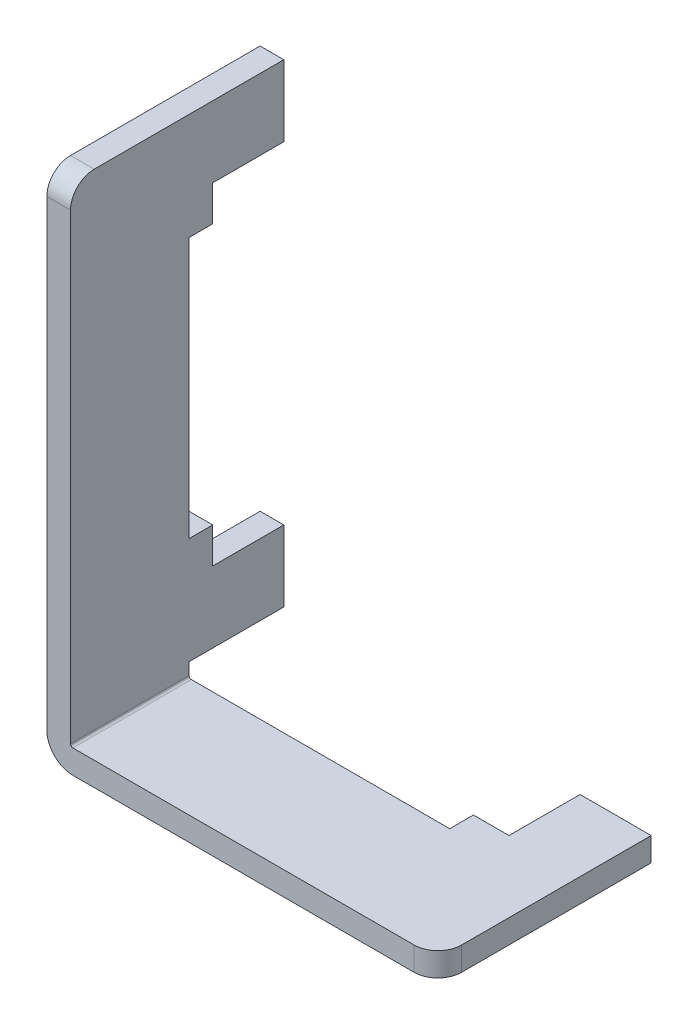
ISO-10303-21;
HEADER;
FILE_DESCRIPTION(('STEP AP214'),'2;1');
FILE_NAME('part.step','',(''),(''),'','','');
FILE_SCHEMA(('AUTOMOTIVE_DESIGN { 1 0 10303 214 1 1 1 1 }'));
ENDSEC;
DATA;
#1=APPLICATION_CONTEXT('core data for automotive mechanical design processes');
#2=APPLICATION_PROTOCOL_DEFINITION('international standard','automotive_design',2000,#1);
#3=PRODUCT_CONTEXT('',#1,'mechanical');
#4=PRODUCT('Part','Part','',(#3));
#5=PRODUCT_RELATED_PRODUCT_CATEGORY('part','',(#4));
#6=PRODUCT_DEFINITION_FORMATION('','',#4);
#7=PRODUCT_DEFINITION_CONTEXT('part definition',#1,'design');
#8=PRODUCT_DEFINITION('design','',#6,#7);
#9=PRODUCT_DEFINITION_SHAPE('','',#8);
#10=(LENGTH_UNIT() NAMED_UNIT(*) SI_UNIT(.MILLI.,.METRE.));
#11=(NAMED_UNIT(*) PLANE_ANGLE_UNIT() SI_UNIT($,.RADIAN.));
#12=(NAMED_UNIT(*) SI_UNIT($,.STERADIAN.) SOLID_ANGLE_UNIT());
#13=UNCERTAINTY_MEASURE_WITH_UNIT(LENGTH_MEASURE(1.E-05),#10,'distance_accuracy_value','');
#14=(GEOMETRIC_REPRESENTATION_CONTEXT(3) GLOBAL_UNCERTAINTY_ASSIGNED_CONTEXT((#13)) GLOBAL_UNIT_ASSIGNED_CONTEXT((#10,
#11,#12)) REPRESENTATION_CONTEXT('',''));
#15=CARTESIAN_POINT('',(0.,0.,0.));
#16=DIRECTION('',(0.,0.,1.));
#17=DIRECTION('',(1.,0.,0.));
#18=AXIS2_PLACEMENT_3D('',#15,#16,#17);
#19=CARTESIAN_POINT('',(-247.66652677768,182.23713577262,9.500000000004));
#20=DIRECTION('',(-1.,0.,0.));
#21=DIRECTION('',(0.,0.,1.));
#22=AXIS2_PLACEMENT_3D('',#19,#20,#21);
#23=PLANE('',#22);
#24=DIRECTION('',(0.,0.,1.));
#25=VECTOR('',#24,1.);
#26=CARTESIAN_POINT('',(-247.66652677768,218.87457845392,1.));
#27=LINE('',#26,#25);
#28=CARTESIAN_POINT('',(-247.66652677768,218.87457845392,1.));
#29=VERTEX_POINT('',#28);
#30=CARTESIAN_POINT('',(-247.66652677768,218.87457845392,6.000000000004));
#31=VERTEX_POINT('',#30);
#32=EDGE_CURVE('E11',#29,#31,#27,.T.);
#33=ORIENTED_EDGE('',*,*,#32,.F.);
#34=DIRECTION('',(0.,1.,0.));
#35=VECTOR('',#34,1.);
#36=CARTESIAN_POINT('',(-247.66652677768,218.87457845392,1.));
#37=LINE('',#36,#35);
#38=CARTESIAN_POINT('',(-247.66652677768,219.37457949272,1.));
#39=VERTEX_POINT('',#38);
#40=EDGE_CURVE('E408',#29,#39,#37,.T.);
#41=ORIENTED_EDGE('',*,*,#40,.T.);
#42=DIRECTION('',(0.,0.,1.));
#43=VECTOR('',#42,1.);
#44=CARTESIAN_POINT('',(-247.66652677768,219.37457949272,-3.));
#45=LINE('',#44,#43);
#46=CARTESIAN_POINT('',(-247.66652677768,219.37457949272,-3.));
#47=VERTEX_POINT('',#46);
#48=EDGE_CURVE('E400',#47,#39,#45,.T.);
#49=ORIENTED_EDGE('',*,*,#48,.F.);
#50=DIRECTION('',(0.,-1.,0.));
#51=VECTOR('',#50,1.);
#52=CARTESIAN_POINT('',(-247.66652677768,222.37457949272,-3.));
#53=LINE('',#52,#51);
#54=CARTESIAN_POINT('',(-247.66652677768,222.37457949272,-3.));
#55=VERTEX_POINT('',#54);
#56=EDGE_CURVE('E393',#55,#47,#53,.T.);
#57=ORIENTED_EDGE('',*,*,#56,.F.);
#58=DIRECTION('',(0.,0.,1.));
#59=VECTOR('',#58,1.);
#60=CARTESIAN_POINT('',(-247.66652677768,222.37457949272,-3.));
#61=LINE('',#60,#59);
#62=CARTESIAN_POINT('',(-247.66652677768,222.37457949272,0.));
#63=VERTEX_POINT('',#62);
#64=EDGE_CURVE('E386',#55,#63,#61,.T.);
#65=ORIENTED_EDGE('',*,*,#64,.T.);
#66=DIRECTION('',(0.,1.,0.));
#67=VECTOR('',#66,1.);
#68=CARTESIAN_POINT('',(-247.66652677768,222.37457949272,0.));
#69=LINE('',#68,#67);
#70=CARTESIAN_POINT('',(-247.66652677768,223.87457949272,0.));
#71=VERTEX_POINT('',#70);
#72=EDGE_CURVE('E379',#63,#71,#69,.T.);
#73=ORIENTED_EDGE('',*,*,#72,.T.);
#74=DIRECTION('',(0.,0.,1.));
#75=VECTOR('',#74,1.);
#76=CARTESIAN_POINT('',(-247.66652677768,223.87457949272,0.));
#77=LINE('',#76,#75);
#78=CARTESIAN_POINT('',(-247.66652677768,223.87457949272,1.));
#79=VERTEX_POINT('',#78);
#80=EDGE_CURVE('E236',#71,#79,#77,.T.);
#81=ORIENTED_EDGE('',*,*,#80,.T.);
#82=DIRECTION('',(0.,1.,0.));
#83=VECTOR('',#82,1.);
#84=CARTESIAN_POINT('',(-247.66652677768,223.87457949272,1.));
#85=LINE('',#84,#83);
#86=CARTESIAN_POINT('',(-247.66652677768,234.87457863472,1.));
#87=VERTEX_POINT('',#86);
#88=EDGE_CURVE('E237',#79,#87,#85,.T.);
#89=ORIENTED_EDGE('',*,*,#88,.T.);
#90=DIRECTION('',(0.,0.,-1.));
#91=VECTOR('',#90,1.);
#92=CARTESIAN_POINT('',(-247.66652677768,234.87457863472,1.));
#93=LINE('',#92,#91);
#94=CARTESIAN_POINT('',(-247.66652677768,234.87457863472,0.));
#95=VERTEX_POINT('',#94);
#96=EDGE_CURVE('E368',#87,#95,#93,.T.);
#97=ORIENTED_EDGE('',*,*,#96,.T.);
#98=DIRECTION('',(0.,-1.,0.));
#99=VECTOR('',#98,1.);
#100=CARTESIAN_POINT('',(-247.66652677768,236.37457800002,0.));
#101=LINE('',#100,#99);
#102=CARTESIAN_POINT('',(-247.66652677768,236.37457800002,0.));
#103=VERTEX_POINT('',#102);
#104=EDGE_CURVE('E360',#103,#95,#101,.T.);
#105=ORIENTED_EDGE('',*,*,#104,.F.);
#106=DIRECTION('',(0.,0.,-1.));
#107=VECTOR('',#106,1.);
#108=CARTESIAN_POINT('',(-247.66652677768,236.37457800002,0.));
#109=LINE('',#108,#107);
#110=CARTESIAN_POINT('',(-247.66652677768,236.37457800002,-3.));
#111=VERTEX_POINT('',#110);
#112=EDGE_CURVE('E223',#103,#111,#109,.T.);
#113=ORIENTED_EDGE('',*,*,#112,.T.);
#114=DIRECTION('',(0.,1.,0.));
#115=VECTOR('',#114,1.);
#116=CARTESIAN_POINT('',(-247.66652677768,236.37457800002,-3.));
#117=LINE('',#116,#115);
#118=CARTESIAN_POINT('',(-247.66652677768,239.37457800002,-3.));
#119=VERTEX_POINT('',#118);
#120=EDGE_CURVE('E352',#111,#119,#117,.T.);
#121=ORIENTED_EDGE('',*,*,#120,.T.);
#122=DIRECTION('',(0.,0.,1.));
#123=VECTOR('',#122,1.);
#124=CARTESIAN_POINT('',(-247.66652677768,239.37457800002,-3.));
#125=LINE('',#124,#123);
#126=CARTESIAN_POINT('',(-247.66652677768,239.37457800002,5.000000000004));
#127=VERTEX_POINT('',#126);
#128=EDGE_CURVE('E282',#119,#127,#125,.T.);
#129=ORIENTED_EDGE('',*,*,#128,.T.);
#130=CARTESIAN_POINT('',(-247.66652677768,238.37457800002,5.000000000004));
#131=DIRECTION('',(1.,0.,0.));
#132=DIRECTION('',(0.,1.,0.));
#133=AXIS2_PLACEMENT_3D('',#130,#131,#132);
#134=CIRCLE('',#133,1.);
#135=CARTESIAN_POINT('',(-247.66652677768,238.37457800002,6.000000000004));
#136=VERTEX_POINT('',#135);
#137=EDGE_CURVE('E289',#127,#136,#134,.T.);
#138=ORIENTED_EDGE('',*,*,#137,.T.);
#139=DIRECTION('',(0.,-1.,0.));
#140=VECTOR('',#139,1.);
#141=CARTESIAN_POINT('',(-247.66652677768,238.37457800002,6.000000000004));
#142=LINE('',#141,#140);
#143=EDGE_CURVE('E267',#136,#31,#142,.T.);
#144=ORIENTED_EDGE('',*,*,#143,.T.);
#145=EDGE_LOOP('',(#33,#41,#49,#57,#65,#73,#81,#89,#97,#105,#113,#121,#129,#138,#144));
#146=FACE_BOUND('',#145,.T.);
#147=ADVANCED_FACE('F16',(#146),#23,.F.);
#148=CARTESIAN_POINT('',(-247.56652677768,218.87457845392,9.500000000004));
#149=DIRECTION('',(0.,0.,1.));
#150=DIRECTION('',(1.,0.,0.));
#151=AXIS2_PLACEMENT_3D('',#148,#149,#150);
#152=CYLINDRICAL_SURFACE('',#151,0.1);
#153=CARTESIAN_POINT('',(-247.56652677768,218.87457845392,1.));
#154=DIRECTION('',(0.,0.,1.));
#155=DIRECTION('',(-1.,5.684341886081E-13,0.));
#156=AXIS2_PLACEMENT_3D('',#153,#154,#155);
#157=CIRCLE('',#156,0.1);
#158=CARTESIAN_POINT('',(-247.56652677768,218.77457845392,1.));
#159=VERTEX_POINT('',#158);
#160=EDGE_CURVE('E411',#29,#159,#157,.T.);
#161=ORIENTED_EDGE('',*,*,#160,.F.);
#162=ORIENTED_EDGE('',*,*,#32,.T.);
#163=CARTESIAN_POINT('',(-247.56652677768,218.87457845392,6.000000000004));
#164=DIRECTION('',(0.,0.,-1.));
#165=DIRECTION('',(0.,-1.,0.));
#166=AXIS2_PLACEMENT_3D('',#163,#164,#165);
#167=CIRCLE('',#166,0.1);
#168=CARTESIAN_POINT('',(-247.56652677768,218.77457845392,6.000000000004));
#169=VERTEX_POINT('',#168);
#170=EDGE_CURVE('E241',#169,#31,#167,.T.);
#171=ORIENTED_EDGE('',*,*,#170,.F.);
#172=DIRECTION('',(0.,0.,-1.));
#173=VECTOR('',#172,1.);
#174=CARTESIAN_POINT('',(-247.56652677768,218.77457845392,6.000000000004));
#175=LINE('',#174,#173);
#176=EDGE_CURVE('E19',#169,#159,#175,.T.);
#177=ORIENTED_EDGE('',*,*,#176,.T.);
#178=EDGE_LOOP('',(#161,#162,#171,#177));
#179=FACE_BOUND('',#178,.T.);
#180=ADVANCED_FACE('F444',(#179),#152,.F.);
#181=CARTESIAN_POINT('',(-253.64712145909,218.77457845392,9.500000000004));
#182=DIRECTION('',(0.,-1.,0.));
#183=DIRECTION('',(0.,0.,-1.));
#184=AXIS2_PLACEMENT_3D('',#181,#182,#183);
#185=PLANE('',#184);
#186=DIRECTION('',(-1.,0.,0.));
#187=VECTOR('',#186,1.);
#188=CARTESIAN_POINT('',(-232.1665294591,218.77457845392,-3.));
#189=LINE('',#188,#187);
#190=CARTESIAN_POINT('',(-232.1665294591,218.77457845392,-3.));
#191=VERTEX_POINT('',#190);
#192=CARTESIAN_POINT('',(-235.1665294591,218.77457845392,-3.));
#193=VERTEX_POINT('',#192);
#194=EDGE_CURVE('E424',#191,#193,#189,.T.);
#195=ORIENTED_EDGE('',*,*,#194,.T.);
#196=DIRECTION('',(0.,0.,1.));
#197=VECTOR('',#196,1.);
#198=CARTESIAN_POINT('',(-235.1665294591,218.77457845392,-3.));
#199=LINE('',#198,#197);
#200=CARTESIAN_POINT('',(-235.1665294591,218.77457845392,0.));
#201=VERTEX_POINT('',#200);
#202=EDGE_CURVE('E219',#193,#201,#199,.T.);
#203=ORIENTED_EDGE('',*,*,#202,.T.);
#204=DIRECTION('',(-1.,0.,0.));
#205=VECTOR('',#204,1.);
#206=CARTESIAN_POINT('',(-235.1665294591,218.77457845392,0.));
#207=LINE('',#206,#205);
#208=CARTESIAN_POINT('',(-236.6665294591,218.77457845392,0.));
#209=VERTEX_POINT('',#208);
#210=EDGE_CURVE('E345',#201,#209,#207,.T.);
#211=ORIENTED_EDGE('',*,*,#210,.T.);
#212=DIRECTION('',(0.,0.,1.));
#213=VECTOR('',#212,1.);
#214=CARTESIAN_POINT('',(-236.6665294591,218.77457845392,0.));
#215=LINE('',#214,#213);
#216=CARTESIAN_POINT('',(-236.6665294591,218.77457845392,1.));
#217=VERTEX_POINT('',#216);
#218=EDGE_CURVE('E336',#209,#217,#215,.T.);
#219=ORIENTED_EDGE('',*,*,#218,.T.);
#220=DIRECTION('',(-1.,0.,0.));
#221=VECTOR('',#220,1.);
#222=CARTESIAN_POINT('',(-236.6665294591,218.77457845392,1.));
#223=LINE('',#222,#221);
#224=EDGE_CURVE('E218',#217,#159,#223,.T.);
#225=ORIENTED_EDGE('',*,*,#224,.T.);
#226=ORIENTED_EDGE('',*,*,#176,.F.);
#227=DIRECTION('',(1.,0.,0.));
#228=VECTOR('',#227,1.);
#229=CARTESIAN_POINT('',(-247.56652677768,218.77457845392,6.000000000004));
#230=LINE('',#229,#228);
#231=CARTESIAN_POINT('',(-233.1665294591,218.77457845392,6.000000000004));
#232=VERTEX_POINT('',#231);
#233=EDGE_CURVE('E238',#169,#232,#230,.T.);
#234=ORIENTED_EDGE('',*,*,#233,.T.);
#235=CARTESIAN_POINT('',(-233.1665294591,218.77457845392,5.000000000004));
#236=DIRECTION('',(0.,1.,0.));
#237=DIRECTION('',(0.,0.,1.));
#238=AXIS2_PLACEMENT_3D('',#235,#236,#237);
#239=CIRCLE('',#238,1.);
#240=CARTESIAN_POINT('',(-232.1665294591,218.77457845392,5.000000000004));
#241=VERTEX_POINT('',#240);
#242=EDGE_CURVE('E32',#232,#241,#239,.T.);
#243=ORIENTED_EDGE('',*,*,#242,.T.);
#244=DIRECTION('',(0.,0.,-1.));
#245=VECTOR('',#244,1.);
#246=CARTESIAN_POINT('',(-232.1665294591,218.77457845392,5.000000000004));
#247=LINE('',#246,#245);
#248=EDGE_CURVE('E37',#241,#191,#247,.T.);
#249=ORIENTED_EDGE('',*,*,#248,.T.);
#250=EDGE_LOOP('',(#195,#203,#211,#219,#225,#226,#234,#243,#249));
#251=FACE_BOUND('',#250,.T.);
#252=ADVANCED_FACE('F448',(#251),#185,.F.);
#253=CARTESIAN_POINT('',(-233.1665294591,217.77457845392,5.000000000004));
#254=DIRECTION('',(0.,-1.,0.));
#255=DIRECTION('',(-1.,0.,0.));
#256=AXIS2_PLACEMENT_3D('',#253,#254,#255);
#257=CYLINDRICAL_SURFACE('',#256,1.);
#258=ORIENTED_EDGE('',*,*,#242,.F.);
#259=DIRECTION('',(0.,-1.,0.));
#260=VECTOR('',#259,1.);
#261=CARTESIAN_POINT('',(-233.1665294591,218.77457845392,6.000000000004));
#262=LINE('',#261,#260);
#263=CARTESIAN_POINT('',(-233.1665294591,217.77457845392,6.000000000004));
#264=VERTEX_POINT('',#263);
#265=EDGE_CURVE('E189',#232,#264,#262,.T.);
#266=ORIENTED_EDGE('',*,*,#265,.T.);
#267=CARTESIAN_POINT('',(-233.1665294591,217.77457845392,5.000000000004));
#268=DIRECTION('',(0.,-1.,0.));
#269=DIRECTION('',(1.,0.,1.06581410364E-12));
#270=AXIS2_PLACEMENT_3D('',#267,#268,#269);
#271=CIRCLE('',#270,1.);
#272=CARTESIAN_POINT('',(-232.1665294591,217.77457845392,5.000000000004));
#273=VERTEX_POINT('',#272);
#274=EDGE_CURVE('E259',#273,#264,#271,.T.);
#275=ORIENTED_EDGE('',*,*,#274,.F.);
#276=DIRECTION('',(0.,1.,0.));
#277=VECTOR('',#276,1.);
#278=CARTESIAN_POINT('',(-232.1665294591,217.77457845392,5.000000000004));
#279=LINE('',#278,#277);
#280=EDGE_CURVE('E432',#273,#241,#279,.T.);
#281=ORIENTED_EDGE('',*,*,#280,.T.);
#282=EDGE_LOOP('',(#258,#266,#275,#281));
#283=FACE_BOUND('',#282,.T.);
#284=ADVANCED_FACE('F459',(#283),#257,.T.);
#285=CARTESIAN_POINT('',(-232.1665294591,218.27457845392,1.500000000004));
#286=DIRECTION('',(1.,0.,0.));
#287=DIRECTION('',(0.,1.,0.));
#288=AXIS2_PLACEMENT_3D('',#285,#286,#287);
#289=PLANE('',#288);
#290=DIRECTION('',(0.,1.,0.));
#291=VECTOR('',#290,1.);
#292=CARTESIAN_POINT('',(-232.1665294591,217.77457845392,-3.));
#293=LINE('',#292,#291);
#294=CARTESIAN_POINT('',(-232.1665294591,217.77457845392,-3.));
#295=VERTEX_POINT('',#294);
#296=EDGE_CURVE('E427',#295,#191,#293,.T.);
#297=ORIENTED_EDGE('',*,*,#296,.T.);
#298=ORIENTED_EDGE('',*,*,#248,.F.);
#299=ORIENTED_EDGE('',*,*,#280,.F.);
#300=DIRECTION('',(0.,0.,-1.));
#301=VECTOR('',#300,1.);
#302=CARTESIAN_POINT('',(-232.1665294591,217.77457845392,5.000000000004));
#303=LINE('',#302,#301);
#304=EDGE_CURVE('E246',#273,#295,#303,.T.);
#305=ORIENTED_EDGE('',*,*,#304,.T.);
#306=EDGE_LOOP('',(#297,#298,#299,#305));
#307=FACE_BOUND('',#306,.T.);
#308=ADVANCED_FACE('F462',(#307),#289,.T.);
#309=CARTESIAN_POINT('',(-238.1665294591,217.77457845392,-3.));
#310=DIRECTION('',(0.,0.,-1.));
#311=DIRECTION('',(0.,-1.,0.));
#312=AXIS2_PLACEMENT_3D('',#309,#310,#311);
#313=PLANE('',#312);
#314=DIRECTION('',(0.,-1.,0.));
#315=VECTOR('',#314,1.);
#316=CARTESIAN_POINT('',(-235.1665294591,218.77457845392,-3.));
#317=LINE('',#316,#315);
#318=CARTESIAN_POINT('',(-235.1665294591,217.77457845392,-3.));
#319=VERTEX_POINT('',#318);
#320=EDGE_CURVE('E220',#193,#319,#317,.T.);
#321=ORIENTED_EDGE('',*,*,#320,.F.);
#322=ORIENTED_EDGE('',*,*,#194,.F.);
#323=ORIENTED_EDGE('',*,*,#296,.F.);
#324=DIRECTION('',(-1.,0.,0.));
#325=VECTOR('',#324,1.);
#326=CARTESIAN_POINT('',(-232.1665294591,217.77457845392,-3.));
#327=LINE('',#326,#325);
#328=EDGE_CURVE('E242',#295,#319,#327,.T.);
#329=ORIENTED_EDGE('',*,*,#328,.T.);
#330=EDGE_LOOP('',(#321,#322,#323,#329));
#331=FACE_BOUND('',#330,.T.);
#332=ADVANCED_FACE('F467',(#331),#313,.T.);
#333=CARTESIAN_POINT('',(-235.1665294591,217.77457845392,0.));
#334=DIRECTION('',(-1.,0.,0.));
#335=DIRECTION('',(0.,0.,1.));
#336=AXIS2_PLACEMENT_3D('',#333,#334,#335);
#337=PLANE('',#336);
#338=DIRECTION('',(0.,1.,0.));
#339=VECTOR('',#338,1.);
#340=CARTESIAN_POINT('',(-235.1665294591,217.77457845392,0.));
#341=LINE('',#340,#339);
#342=CARTESIAN_POINT('',(-235.1665294591,217.77457845392,0.));
#343=VERTEX_POINT('',#342);
#344=EDGE_CURVE('E221',#343,#201,#341,.T.);
#345=ORIENTED_EDGE('',*,*,#344,.T.);
#346=ORIENTED_EDGE('',*,*,#202,.F.);
#347=ORIENTED_EDGE('',*,*,#320,.T.);
#348=DIRECTION('',(0.,0.,1.));
#349=VECTOR('',#348,1.);
#350=CARTESIAN_POINT('',(-235.1665294591,217.77457845392,-3.));
#351=LINE('',#350,#349);
#352=EDGE_CURVE('E247',#319,#343,#351,.T.);
#353=ORIENTED_EDGE('',*,*,#352,.T.);
#354=EDGE_LOOP('',(#345,#346,#347,#353));
#355=FACE_BOUND('',#354,.T.);
#356=ADVANCED_FACE('F472',(#355),#337,.T.);
#357=CARTESIAN_POINT('',(-241.3665281184,218.27457845392,0.));
#358=DIRECTION('',(0.,0.,-1.));
#359=DIRECTION('',(0.,-1.,0.));
#360=AXIS2_PLACEMENT_3D('',#357,#358,#359);
#361=PLANE('',#360);
#362=ORIENTED_EDGE('',*,*,#210,.F.);
#363=ORIENTED_EDGE('',*,*,#344,.F.);
#364=DIRECTION('',(1.,0.,0.));
#365=VECTOR('',#364,1.);
#366=CARTESIAN_POINT('',(-236.6665294591,217.77457845392,0.));
#367=LINE('',#366,#365);
#368=CARTESIAN_POINT('',(-236.6665294591,217.77457845392,0.));
#369=VERTEX_POINT('',#368);
#370=EDGE_CURVE('E263',#369,#343,#367,.T.);
#371=ORIENTED_EDGE('',*,*,#370,.F.);
#372=DIRECTION('',(0.,-1.,0.));
#373=VECTOR('',#372,1.);
#374=CARTESIAN_POINT('',(-236.6665294591,218.77457845392,0.));
#375=LINE('',#374,#373);
#376=EDGE_CURVE('E339',#209,#369,#375,.T.);
#377=ORIENTED_EDGE('',*,*,#376,.F.);
#378=EDGE_LOOP('',(#362,#363,#371,#377));
#379=FACE_BOUND('',#378,.T.);
#380=ADVANCED_FACE('F476',(#379),#361,.T.);
#381=CARTESIAN_POINT('',(-236.6665294591,218.77457845392,1.));
#382=DIRECTION('',(-1.,0.,0.));
#383=DIRECTION('',(0.,0.,1.));
#384=AXIS2_PLACEMENT_3D('',#381,#382,#383);
#385=PLANE('',#384);
#386=ORIENTED_EDGE('',*,*,#218,.F.);
#387=ORIENTED_EDGE('',*,*,#376,.T.);
#388=DIRECTION('',(0.,0.,1.));
#389=VECTOR('',#388,1.);
#390=CARTESIAN_POINT('',(-236.6665294591,217.77457845392,0.));
#391=LINE('',#390,#389);
#392=CARTESIAN_POINT('',(-236.6665294591,217.77457845392,1.));
#393=VERTEX_POINT('',#392);
#394=EDGE_CURVE('E250',#369,#393,#391,.T.);
#395=ORIENTED_EDGE('',*,*,#394,.T.);
#396=DIRECTION('',(0.,-1.,0.));
#397=VECTOR('',#396,1.);
#398=CARTESIAN_POINT('',(-236.6665294591,218.77457845392,1.));
#399=LINE('',#398,#397);
#400=EDGE_CURVE('E340',#217,#393,#399,.T.);
#401=ORIENTED_EDGE('',*,*,#400,.F.);
#402=EDGE_LOOP('',(#386,#387,#395,#401));
#403=FACE_BOUND('',#402,.T.);
#404=ADVANCED_FACE('F479',(#403),#385,.T.);
#405=CARTESIAN_POINT('',(-246.64712145909,217.77457845392,1.));
#406=DIRECTION('',(0.,0.,-1.));
#407=DIRECTION('',(0.,-1.,0.));
#408=AXIS2_PLACEMENT_3D('',#405,#406,#407);
#409=PLANE('',#408);
#410=DIRECTION('',(-1.98436515405206E-06,0.999999999998031,0.));
#411=VECTOR('',#410,1.);
#412=CARTESIAN_POINT('',(-248.66652677768,218.87457845392,1.));
#413=LINE('',#412,#411);
#414=CARTESIAN_POINT('',(-248.66652677768,218.87457845392,1.));
#415=VERTEX_POINT('',#414);
#416=CARTESIAN_POINT('',(-248.66652776986,219.37457949272,1.));
#417=VERTEX_POINT('',#416);
#418=EDGE_CURVE('E198',#415,#417,#413,.T.);
#419=ORIENTED_EDGE('',*,*,#418,.T.);
#420=DIRECTION('',(1.,0.,0.));
#421=VECTOR('',#420,1.);
#422=CARTESIAN_POINT('',(-248.66652776986,219.37457949272,1.));
#423=LINE('',#422,#421);
#424=EDGE_CURVE('E404',#417,#39,#423,.T.);
#425=ORIENTED_EDGE('',*,*,#424,.T.);
#426=ORIENTED_EDGE('',*,*,#40,.F.);
#427=ORIENTED_EDGE('',*,*,#160,.T.);
#428=ORIENTED_EDGE('',*,*,#224,.F.);
#429=ORIENTED_EDGE('',*,*,#400,.T.);
#430=DIRECTION('',(-1.,0.,0.));
#431=VECTOR('',#430,1.);
#432=CARTESIAN_POINT('',(-236.6665294591,217.77457845392,1.));
#433=LINE('',#432,#431);
#434=CARTESIAN_POINT('',(-247.56652677768,217.77457845392,1.));
#435=VERTEX_POINT('',#434);
#436=EDGE_CURVE('E232',#393,#435,#433,.T.);
#437=ORIENTED_EDGE('',*,*,#436,.T.);
#438=CARTESIAN_POINT('',(-247.56652677768,218.87457845392,1.));
#439=DIRECTION('',(0.,0.,-1.));
#440=DIRECTION('',(0.,-1.,0.));
#441=AXIS2_PLACEMENT_3D('',#438,#439,#440);
#442=CIRCLE('',#441,1.1);
#443=EDGE_CURVE('E203',#435,#415,#442,.T.);
#444=ORIENTED_EDGE('',*,*,#443,.T.);
#445=EDGE_LOOP('',(#419,#425,#426,#427,#428,#429,#437,#444));
#446=FACE_BOUND('',#445,.T.);
#447=ADVANCED_FACE('F452',(#446),#409,.T.);
#448=CARTESIAN_POINT('',(-248.66652975423,219.37457949272,1.));
#449=DIRECTION('',(0.,-1.,0.));
#450=DIRECTION('',(0.,0.,-1.));
#451=AXIS2_PLACEMENT_3D('',#448,#449,#450);
#452=PLANE('',#451);
#453=DIRECTION('',(2.48046166717593E-07,0.,0.999999999999969));
#454=VECTOR('',#453,1.);
#455=CARTESIAN_POINT('',(-248.66652876205,219.37457949272,-3.));
#456=LINE('',#455,#454);
#457=CARTESIAN_POINT('',(-248.66652876205,219.37457949272,-3.));
#458=VERTEX_POINT('',#457);
#459=EDGE_CURVE('E335',#458,#417,#456,.T.);
#460=ORIENTED_EDGE('',*,*,#459,.F.);
#461=DIRECTION('',(-1.,0.,0.));
#462=VECTOR('',#461,1.);
#463=CARTESIAN_POINT('',(-247.66652677768,219.37457949272,-3.));
#464=LINE('',#463,#462);
#465=EDGE_CURVE('E397',#47,#458,#464,.T.);
#466=ORIENTED_EDGE('',*,*,#465,.F.);
#467=ORIENTED_EDGE('',*,*,#48,.T.);
#468=ORIENTED_EDGE('',*,*,#424,.F.);
#469=EDGE_LOOP('',(#460,#466,#467,#468));
#470=FACE_BOUND('',#469,.T.);
#471=ADVANCED_FACE('F516',(#470),#452,.T.);
#472=CARTESIAN_POINT('',(-238.1665294591,217.77457845392,-3.));
#473=DIRECTION('',(0.,0.,-1.));
#474=DIRECTION('',(0.,-1.,0.));
#475=AXIS2_PLACEMENT_3D('',#472,#473,#474);
#476=PLANE('',#475);
#477=DIRECTION('',(1.,0.,0.));
#478=VECTOR('',#477,1.);
#479=CARTESIAN_POINT('',(-248.66652876205,222.37457949272,-3.));
#480=LINE('',#479,#478);
#481=CARTESIAN_POINT('',(-248.66652876205,222.37457949272,-3.));
#482=VERTEX_POINT('',#481);
#483=EDGE_CURVE('E389',#482,#55,#480,.T.);
#484=ORIENTED_EDGE('',*,*,#483,.T.);
#485=ORIENTED_EDGE('',*,*,#56,.T.);
#486=ORIENTED_EDGE('',*,*,#465,.T.);
#487=DIRECTION('',(0.,1.,0.));
#488=VECTOR('',#487,1.);
#489=CARTESIAN_POINT('',(-248.66652876205,219.37457949272,-3.));
#490=LINE('',#489,#488);
#491=EDGE_CURVE('E331',#458,#482,#490,.T.);
#492=ORIENTED_EDGE('',*,*,#491,.T.);
#493=EDGE_LOOP('',(#484,#485,#486,#492));
#494=FACE_BOUND('',#493,.T.);
#495=ADVANCED_FACE('F519',(#494),#476,.T.);
#496=CARTESIAN_POINT('',(-247.66652677768,222.37457949272,1.));
#497=DIRECTION('',(0.,1.,0.));
#498=DIRECTION('',(1.,0.,0.));
#499=AXIS2_PLACEMENT_3D('',#496,#497,#498);
#500=PLANE('',#499);
#501=ORIENTED_EDGE('',*,*,#64,.F.);
#502=ORIENTED_EDGE('',*,*,#483,.F.);
#503=DIRECTION('',(3.30728222290115E-07,0.,0.999999999999945));
#504=VECTOR('',#503,1.);
#505=CARTESIAN_POINT('',(-248.66652876205,222.37457949272,-3.));
#506=LINE('',#505,#504);
#507=CARTESIAN_POINT('',(-248.66652776986,222.37457949272,0.));
#508=VERTEX_POINT('',#507);
#509=EDGE_CURVE('E327',#482,#508,#506,.T.);
#510=ORIENTED_EDGE('',*,*,#509,.T.);
#511=DIRECTION('',(1.,0.,0.));
#512=VECTOR('',#511,1.);
#513=CARTESIAN_POINT('',(-248.66652776986,222.37457949272,0.));
#514=LINE('',#513,#512);
#515=EDGE_CURVE('E382',#508,#63,#514,.T.);
#516=ORIENTED_EDGE('',*,*,#515,.T.);
#517=EDGE_LOOP('',(#501,#502,#510,#516));
#518=FACE_BOUND('',#517,.T.);
#519=ADVANCED_FACE('F521',(#518),#500,.T.);
#520=CARTESIAN_POINT('',(-248.16652677768,228.87457906372,0.));
#521=DIRECTION('',(0.,0.,-1.));
#522=DIRECTION('',(0.,-1.,0.));
#523=AXIS2_PLACEMENT_3D('',#520,#521,#522);
#524=PLANE('',#523);
#525=ORIENTED_EDGE('',*,*,#72,.F.);
#526=ORIENTED_EDGE('',*,*,#515,.F.);
#527=DIRECTION('',(-6.61456444580088E-07,-0.999999999999781,0.));
#528=VECTOR('',#527,1.);
#529=CARTESIAN_POINT('',(-248.66652677768,223.87457949272,0.));
#530=LINE('',#529,#528);
#531=CARTESIAN_POINT('',(-248.66652677768,223.87457949272,0.));
#532=VERTEX_POINT('',#531);
#533=EDGE_CURVE('E323',#532,#508,#530,.T.);
#534=ORIENTED_EDGE('',*,*,#533,.F.);
#535=DIRECTION('',(-1.,0.,0.));
#536=VECTOR('',#535,1.);
#537=CARTESIAN_POINT('',(-247.66652677768,223.87457949272,0.));
#538=LINE('',#537,#536);
#539=EDGE_CURVE('E376',#71,#532,#538,.T.);
#540=ORIENTED_EDGE('',*,*,#539,.F.);
#541=EDGE_LOOP('',(#525,#526,#534,#540));
#542=FACE_BOUND('',#541,.T.);
#543=ADVANCED_FACE('F524',(#542),#524,.T.);
#544=CARTESIAN_POINT('',(-247.66652677768,223.87457949272,1.));
#545=DIRECTION('',(0.,1.,0.));
#546=DIRECTION('',(1.,0.,0.));
#547=AXIS2_PLACEMENT_3D('',#544,#545,#546);
#548=PLANE('',#547);
#549=ORIENTED_EDGE('',*,*,#80,.F.);
#550=ORIENTED_EDGE('',*,*,#539,.T.);
#551=DIRECTION('',(0.,0.,1.));
#552=VECTOR('',#551,1.);
#553=CARTESIAN_POINT('',(-248.66652677768,223.87457949272,0.));
#554=LINE('',#553,#552);
#555=CARTESIAN_POINT('',(-248.66652677768,223.87457949272,1.));
#556=VERTEX_POINT('',#555);
#557=EDGE_CURVE('E318',#532,#556,#554,.T.);
#558=ORIENTED_EDGE('',*,*,#557,.T.);
#559=DIRECTION('',(-1.,0.,0.));
#560=VECTOR('',#559,1.);
#561=CARTESIAN_POINT('',(-247.66652677768,223.87457949272,1.));
#562=LINE('',#561,#560);
#563=EDGE_CURVE('E233',#79,#556,#562,.T.);
#564=ORIENTED_EDGE('',*,*,#563,.F.);
#565=EDGE_LOOP('',(#549,#550,#558,#564));
#566=FACE_BOUND('',#565,.T.);
#567=ADVANCED_FACE('F526',(#566),#548,.T.);
#568=CARTESIAN_POINT('',(-246.64712145909,217.77457845392,1.));
#569=DIRECTION('',(0.,0.,-1.));
#570=DIRECTION('',(0.,-1.,0.));
#571=AXIS2_PLACEMENT_3D('',#568,#569,#570);
#572=PLANE('',#571);
#573=DIRECTION('',(0.,1.,0.));
#574=VECTOR('',#573,1.);
#575=CARTESIAN_POINT('',(-248.66652677768,223.87457949272,1.));
#576=LINE('',#575,#574);
#577=CARTESIAN_POINT('',(-248.66652677768,234.87457863472,1.));
#578=VERTEX_POINT('',#577);
#579=EDGE_CURVE('E315',#556,#578,#576,.T.);
#580=ORIENTED_EDGE('',*,*,#579,.T.);
#581=DIRECTION('',(1.,0.,0.));
#582=VECTOR('',#581,1.);
#583=CARTESIAN_POINT('',(-248.66652677768,234.87457863472,1.));
#584=LINE('',#583,#582);
#585=EDGE_CURVE('E253',#578,#87,#584,.T.);
#586=ORIENTED_EDGE('',*,*,#585,.T.);
#587=ORIENTED_EDGE('',*,*,#88,.F.);
#588=ORIENTED_EDGE('',*,*,#563,.T.);
#589=EDGE_LOOP('',(#580,#586,#587,#588));
#590=FACE_BOUND('',#589,.T.);
#591=ADVANCED_FACE('F529',(#590),#572,.T.);
#592=CARTESIAN_POINT('',(-248.66652677768,234.87457863472,1.));
#593=DIRECTION('',(0.,-1.,0.));
#594=DIRECTION('',(0.,0.,-1.));
#595=AXIS2_PLACEMENT_3D('',#592,#593,#594);
#596=PLANE('',#595);
#597=DIRECTION('',(0.,0.,-1.));
#598=VECTOR('',#597,1.);
#599=CARTESIAN_POINT('',(-248.66652677768,234.87457863472,1.));
#600=LINE('',#599,#598);
#601=CARTESIAN_POINT('',(-248.66652677768,234.87457863472,0.));
#602=VERTEX_POINT('',#601);
#603=EDGE_CURVE('E311',#578,#602,#600,.T.);
#604=ORIENTED_EDGE('',*,*,#603,.T.);
#605=DIRECTION('',(1.,0.,0.));
#606=VECTOR('',#605,1.);
#607=CARTESIAN_POINT('',(-248.66652677768,234.87457863472,0.));
#608=LINE('',#607,#606);
#609=EDGE_CURVE('E364',#602,#95,#608,.T.);
#610=ORIENTED_EDGE('',*,*,#609,.T.);
#611=ORIENTED_EDGE('',*,*,#96,.F.);
#612=ORIENTED_EDGE('',*,*,#585,.F.);
#613=EDGE_LOOP('',(#604,#610,#611,#612));
#614=FACE_BOUND('',#613,.T.);
#615=ADVANCED_FACE('F533',(#614),#596,.T.);
#616=CARTESIAN_POINT('',(-232.6665264591,233.37457645392,0.));
#617=DIRECTION('',(0.,0.,-1.));
#618=DIRECTION('',(0.,-1.,0.));
#619=AXIS2_PLACEMENT_3D('',#616,#617,#618);
#620=PLANE('',#619);
#621=DIRECTION('',(0.,1.,0.));
#622=VECTOR('',#621,1.);
#623=CARTESIAN_POINT('',(-248.66652677768,234.87457863472,0.));
#624=LINE('',#623,#622);
#625=CARTESIAN_POINT('',(-248.66652677768,236.37457800002,0.));
#626=VERTEX_POINT('',#625);
#627=EDGE_CURVE('E307',#602,#626,#624,.T.);
#628=ORIENTED_EDGE('',*,*,#627,.T.);
#629=DIRECTION('',(-1.,0.,0.));
#630=VECTOR('',#629,1.);
#631=CARTESIAN_POINT('',(-247.66652677768,236.37457800002,0.));
#632=LINE('',#631,#630);
#633=EDGE_CURVE('E226',#103,#626,#632,.T.);
#634=ORIENTED_EDGE('',*,*,#633,.F.);
#635=ORIENTED_EDGE('',*,*,#104,.T.);
#636=ORIENTED_EDGE('',*,*,#609,.F.);
#637=EDGE_LOOP('',(#628,#634,#635,#636));
#638=FACE_BOUND('',#637,.T.);
#639=ADVANCED_FACE('F537',(#638),#620,.T.);
#640=CARTESIAN_POINT('',(-248.66652677768,236.37457800002,-3.2));
#641=DIRECTION('',(0.,-1.,0.));
#642=DIRECTION('',(0.,0.,-1.));
#643=AXIS2_PLACEMENT_3D('',#640,#641,#642);
#644=PLANE('',#643);
#645=DIRECTION('',(0.,0.,-1.));
#646=VECTOR('',#645,1.);
#647=CARTESIAN_POINT('',(-248.66652677768,236.37457800002,0.));
#648=LINE('',#647,#646);
#649=CARTESIAN_POINT('',(-248.66652677768,236.37457800002,-3.));
#650=VERTEX_POINT('',#649);
#651=EDGE_CURVE('E303',#626,#650,#648,.T.);
#652=ORIENTED_EDGE('',*,*,#651,.T.);
#653=DIRECTION('',(1.,0.,0.));
#654=VECTOR('',#653,1.);
#655=CARTESIAN_POINT('',(-248.66652677768,236.37457800002,-3.));
#656=LINE('',#655,#654);
#657=EDGE_CURVE('E227',#650,#111,#656,.T.);
#658=ORIENTED_EDGE('',*,*,#657,.T.);
#659=ORIENTED_EDGE('',*,*,#112,.F.);
#660=ORIENTED_EDGE('',*,*,#633,.T.);
#661=EDGE_LOOP('',(#652,#658,#659,#660));
#662=FACE_BOUND('',#661,.T.);
#663=ADVANCED_FACE('F541',(#662),#644,.T.);
#664=CARTESIAN_POINT('',(-248.66652677768,237.87457800002,-3.));
#665=DIRECTION('',(0.,0.,-1.));
#666=DIRECTION('',(0.,-1.,0.));
#667=AXIS2_PLACEMENT_3D('',#664,#665,#666);
#668=PLANE('',#667);
#669=DIRECTION('',(-1.,0.,0.));
#670=VECTOR('',#669,1.);
#671=CARTESIAN_POINT('',(-247.66652677768,239.37457800002,-3.));
#672=LINE('',#671,#670);
#673=CARTESIAN_POINT('',(-248.66652677768,239.37457800002,-3.));
#674=VERTEX_POINT('',#673);
#675=EDGE_CURVE('E284',#119,#674,#672,.T.);
#676=ORIENTED_EDGE('',*,*,#675,.F.);
#677=ORIENTED_EDGE('',*,*,#120,.F.);
#678=ORIENTED_EDGE('',*,*,#657,.F.);
#679=DIRECTION('',(0.,1.,0.));
#680=VECTOR('',#679,1.);
#681=CARTESIAN_POINT('',(-248.66652677768,236.37457800002,-3.));
#682=LINE('',#681,#680);
#683=EDGE_CURVE('E299',#650,#674,#682,.T.);
#684=ORIENTED_EDGE('',*,*,#683,.T.);
#685=EDGE_LOOP('',(#676,#677,#678,#684));
#686=FACE_BOUND('',#685,.T.);
#687=ADVANCED_FACE('F543',(#686),#668,.T.);
#688=CARTESIAN_POINT('',(-248.66652677768,239.37457800002,0.));
#689=DIRECTION('',(0.,1.,0.));
#690=DIRECTION('',(1.,0.,0.));
#691=AXIS2_PLACEMENT_3D('',#688,#689,#690);
#692=PLANE('',#691);
#693=ORIENTED_EDGE('',*,*,#128,.F.);
#694=ORIENTED_EDGE('',*,*,#675,.T.);
#695=DIRECTION('',(0.,0.,1.));
#696=VECTOR('',#695,1.);
#697=CARTESIAN_POINT('',(-248.66652677768,239.37457800002,-3.));
#698=LINE('',#697,#696);
#699=CARTESIAN_POINT('',(-248.66652677768,239.37457800002,5.000000000004));
#700=VERTEX_POINT('',#699);
#701=EDGE_CURVE('E285',#674,#700,#698,.T.);
#702=ORIENTED_EDGE('',*,*,#701,.T.);
#703=DIRECTION('',(-1.,0.,0.));
#704=VECTOR('',#703,1.);
#705=CARTESIAN_POINT('',(-247.66652677768,239.37457800002,5.000000000004));
#706=LINE('',#705,#704);
#707=EDGE_CURVE('E292',#127,#700,#706,.T.);
#708=ORIENTED_EDGE('',*,*,#707,.F.);
#709=EDGE_LOOP('',(#693,#694,#702,#708));
#710=FACE_BOUND('',#709,.T.);
#711=ADVANCED_FACE('F546',(#710),#692,.T.);
#712=CARTESIAN_POINT('',(-248.66652677768,220.77458000002,1.));
#713=DIRECTION('',(-1.,0.,0.));
#714=DIRECTION('',(0.,0.,1.));
#715=AXIS2_PLACEMENT_3D('',#712,#713,#714);
#716=PLANE('',#715);
#717=ORIENTED_EDGE('',*,*,#683,.F.);
#718=ORIENTED_EDGE('',*,*,#651,.F.);
#719=ORIENTED_EDGE('',*,*,#627,.F.);
#720=ORIENTED_EDGE('',*,*,#603,.F.);
#721=ORIENTED_EDGE('',*,*,#579,.F.);
#722=ORIENTED_EDGE('',*,*,#557,.F.);
#723=ORIENTED_EDGE('',*,*,#533,.T.);
#724=ORIENTED_EDGE('',*,*,#509,.F.);
#725=ORIENTED_EDGE('',*,*,#491,.F.);
#726=ORIENTED_EDGE('',*,*,#459,.T.);
#727=ORIENTED_EDGE('',*,*,#418,.F.);
#728=DIRECTION('',(0.,0.,-1.));
#729=VECTOR('',#728,1.);
#730=CARTESIAN_POINT('',(-248.66652677768,218.87457845392,6.000000000004));
#731=LINE('',#730,#729);
#732=CARTESIAN_POINT('',(-248.66652677768,218.87457845392,6.000000000004));
#733=VERTEX_POINT('',#732);
#734=EDGE_CURVE('E193',#733,#415,#731,.T.);
#735=ORIENTED_EDGE('',*,*,#734,.F.);
#736=DIRECTION('',(0.,-1.,0.));
#737=VECTOR('',#736,1.);
#738=CARTESIAN_POINT('',(-248.66652677768,238.37457800002,6.000000000004));
#739=LINE('',#738,#737);
#740=CARTESIAN_POINT('',(-248.66652677768,238.37457800002,6.000000000004));
#741=VERTEX_POINT('',#740);
#742=EDGE_CURVE('E177',#741,#733,#739,.T.);
#743=ORIENTED_EDGE('',*,*,#742,.F.);
#744=CARTESIAN_POINT('',(-248.66652677768,238.37457800002,5.000000000004));
#745=DIRECTION('',(-1.,0.,0.));
#746=DIRECTION('',(0.,0.,1.));
#747=AXIS2_PLACEMENT_3D('',#744,#745,#746);
#748=CIRCLE('',#747,1.);
#749=EDGE_CURVE('E296',#741,#700,#748,.T.);
#750=ORIENTED_EDGE('',*,*,#749,.T.);
#751=ORIENTED_EDGE('',*,*,#701,.F.);
#752=EDGE_LOOP('',(#717,#718,#719,#720,#721,#722,#723,#724,#725,#726,#727,#735,#743,#750,#751));
#753=FACE_BOUND('',#752,.T.);
#754=ADVANCED_FACE('F195',(#753),#716,.T.);
#755=CARTESIAN_POINT('',(-238.6471214591,238.37457800002,5.000000000004));
#756=DIRECTION('',(-1.,0.,0.));
#757=DIRECTION('',(0.,0.,1.));
#758=AXIS2_PLACEMENT_3D('',#755,#756,#757);
#759=CYLINDRICAL_SURFACE('',#758,1.);
#760=ORIENTED_EDGE('',*,*,#137,.F.);
#761=ORIENTED_EDGE('',*,*,#707,.T.);
#762=ORIENTED_EDGE('',*,*,#749,.F.);
#763=DIRECTION('',(1.,0.,0.));
#764=VECTOR('',#763,1.);
#765=CARTESIAN_POINT('',(-248.66652677768,238.37457800002,6.000000000004));
#766=LINE('',#765,#764);
#767=EDGE_CURVE('E185',#741,#136,#766,.T.);
#768=ORIENTED_EDGE('',*,*,#767,.T.);
#769=EDGE_LOOP('',(#760,#761,#762,#768));
#770=FACE_BOUND('',#769,.T.);
#771=ADVANCED_FACE('F491',(#770),#759,.T.);
#772=CARTESIAN_POINT('',(-281.38091568651,217.77457845392,6.000000000004));
#773=DIRECTION('',(0.,0.,1.));
#774=DIRECTION('',(1.,0.,0.));
#775=AXIS2_PLACEMENT_3D('',#772,#773,#774);
#776=PLANE('',#775);
#777=ORIENTED_EDGE('',*,*,#742,.T.);
#778=CARTESIAN_POINT('',(-247.56652677768,218.87457845392,6.000000000004));
#779=DIRECTION('',(0.,0.,1.));
#780=DIRECTION('',(-1.,-7.751375299201E-13,0.));
#781=AXIS2_PLACEMENT_3D('',#778,#779,#780);
#782=CIRCLE('',#781,1.1);
#783=CARTESIAN_POINT('',(-247.56652677768,217.77457845392,6.000000000004));
#784=VERTEX_POINT('',#783);
#785=EDGE_CURVE('E182',#733,#784,#782,.T.);
#786=ORIENTED_EDGE('',*,*,#785,.T.);
#787=DIRECTION('',(1.,0.,0.));
#788=VECTOR('',#787,1.);
#789=CARTESIAN_POINT('',(-247.56652677768,217.77457845392,6.000000000004));
#790=LINE('',#789,#788);
#791=EDGE_CURVE('E190',#784,#264,#790,.T.);
#792=ORIENTED_EDGE('',*,*,#791,.T.);
#793=ORIENTED_EDGE('',*,*,#265,.F.);
#794=ORIENTED_EDGE('',*,*,#233,.F.);
#795=ORIENTED_EDGE('',*,*,#170,.T.);
#796=ORIENTED_EDGE('',*,*,#143,.F.);
#797=ORIENTED_EDGE('',*,*,#767,.F.);
#798=EDGE_LOOP('',(#777,#786,#792,#793,#794,#795,#796,#797));
#799=FACE_BOUND('',#798,.T.);
#800=ADVANCED_FACE('F179',(#799),#776,.T.);
#801=CARTESIAN_POINT('',(-265.16652645909,217.77457845392,1.));
#802=DIRECTION('',(0.,-1.,0.));
#803=DIRECTION('',(0.,0.,-1.));
#804=AXIS2_PLACEMENT_3D('',#801,#802,#803);
#805=PLANE('',#804);
#806=DIRECTION('',(0.,0.,1.));
#807=VECTOR('',#806,1.);
#808=CARTESIAN_POINT('',(-247.56652677768,217.77457845392,1.));
#809=LINE('',#808,#807);
#810=EDGE_CURVE('E208',#435,#784,#809,.T.);
#811=ORIENTED_EDGE('',*,*,#810,.F.);
#812=ORIENTED_EDGE('',*,*,#436,.F.);
#813=ORIENTED_EDGE('',*,*,#394,.F.);
#814=ORIENTED_EDGE('',*,*,#370,.T.);
#815=ORIENTED_EDGE('',*,*,#352,.F.);
#816=ORIENTED_EDGE('',*,*,#328,.F.);
#817=ORIENTED_EDGE('',*,*,#304,.F.);
#818=ORIENTED_EDGE('',*,*,#274,.T.);
#819=ORIENTED_EDGE('',*,*,#791,.F.);
#820=EDGE_LOOP('',(#811,#812,#813,#814,#815,#816,#817,#818,#819));
#821=FACE_BOUND('',#820,.T.);
#822=ADVANCED_FACE('F482',(#821),#805,.T.);
#823=CARTESIAN_POINT('',(-247.56652677768,218.87457845392,9.500000000004));
#824=DIRECTION('',(0.,0.,1.));
#825=DIRECTION('',(1.,0.,0.));
#826=AXIS2_PLACEMENT_3D('',#823,#824,#825);
#827=CYLINDRICAL_SURFACE('',#826,1.1);
#828=ORIENTED_EDGE('',*,*,#785,.F.);
#829=ORIENTED_EDGE('',*,*,#734,.T.);
#830=ORIENTED_EDGE('',*,*,#443,.F.);
#831=ORIENTED_EDGE('',*,*,#810,.T.);
#832=EDGE_LOOP('',(#828,#829,#830,#831));
#833=FACE_BOUND('',#832,.T.);
#834=ADVANCED_FACE('F206',(#833),#827,.T.);
#835=CLOSED_SHELL('',(#147,#180,#252,#284,#308,#332,#356,#380,#404,#447,#471,#495,#519,#543,
#567,#591,#615,#639,#663,#687,#711,#754,#771,#800,#822,#834));
#836=MANIFOLD_SOLID_BREP('B1',#835);
#837=ADVANCED_BREP_SHAPE_REPRESENTATION('',(#18,#836),#14);
#838=SHAPE_DEFINITION_REPRESENTATION(#9,#837);
ENDSEC;
END-ISO-10303-21;
